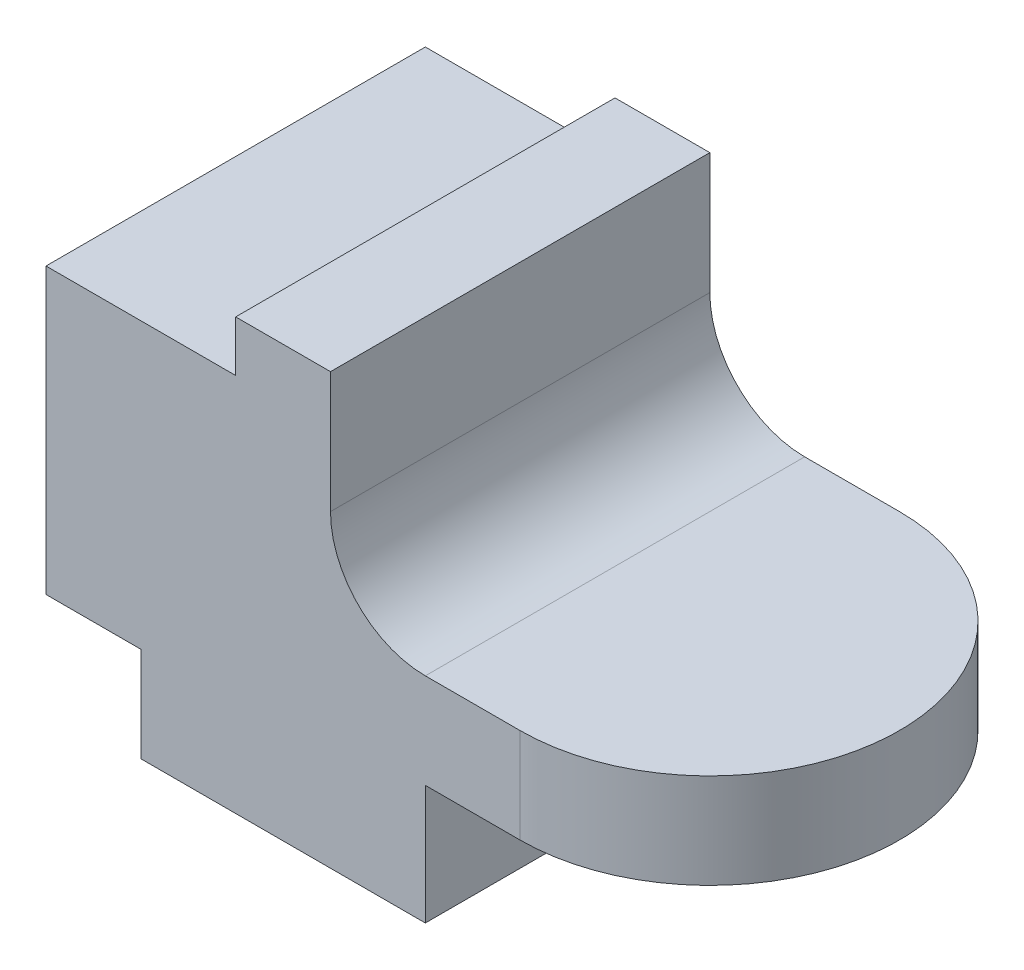
ISO-10303-21;
HEADER;
FILE_DESCRIPTION(('STEP AP214'),'2;1');
FILE_NAME('part.step','',(''),(''),'','','');
FILE_SCHEMA(('AUTOMOTIVE_DESIGN { 1 0 10303 214 1 1 1 1 }'));
ENDSEC;
DATA;
#1=APPLICATION_CONTEXT('core data for automotive mechanical design processes');
#2=APPLICATION_PROTOCOL_DEFINITION('international standard','automotive_design',2000,#1);
#3=PRODUCT_CONTEXT('',#1,'mechanical');
#4=PRODUCT('Part','Part','',(#3));
#5=PRODUCT_RELATED_PRODUCT_CATEGORY('part','',(#4));
#6=PRODUCT_DEFINITION_FORMATION('','',#4);
#7=PRODUCT_DEFINITION_CONTEXT('part definition',#1,'design');
#8=PRODUCT_DEFINITION('design','',#6,#7);
#9=PRODUCT_DEFINITION_SHAPE('','',#8);
#10=(LENGTH_UNIT() NAMED_UNIT(*) SI_UNIT(.MILLI.,.METRE.));
#11=(NAMED_UNIT(*) PLANE_ANGLE_UNIT() SI_UNIT($,.RADIAN.));
#12=(NAMED_UNIT(*) SI_UNIT($,.STERADIAN.) SOLID_ANGLE_UNIT());
#13=UNCERTAINTY_MEASURE_WITH_UNIT(LENGTH_MEASURE(1.E-05),#10,'distance_accuracy_value','');
#14=(GEOMETRIC_REPRESENTATION_CONTEXT(3) GLOBAL_UNCERTAINTY_ASSIGNED_CONTEXT((#13)) GLOBAL_UNIT_ASSIGNED_CONTEXT((#10,
#11,#12)) REPRESENTATION_CONTEXT('',''));
#15=CARTESIAN_POINT('',(0.,0.,0.));
#16=DIRECTION('',(0.,0.,1.));
#17=DIRECTION('',(1.,0.,0.));
#18=AXIS2_PLACEMENT_3D('',#15,#16,#17);
#19=CARTESIAN_POINT('',(34.1908713692946,-8.87966804979253,40.));
#20=DIRECTION('',(0.,1.,0.));
#21=DIRECTION('',(-1.,0.,0.));
#22=AXIS2_PLACEMENT_3D('',#19,#20,#21);
#23=PLANE('',#22);
#24=CARTESIAN_POINT('',(14.1908713692946,-8.87966804979253,20.));
#25=DIRECTION('',(0.,1.,0.));
#26=DIRECTION('',(-1.,0.,0.));
#27=AXIS2_PLACEMENT_3D('',#24,#25,#26);
#28=CIRCLE('',#27,20.);
#29=CARTESIAN_POINT('',(14.1908713692946,-8.87966804979253,40.));
#30=VERTEX_POINT('',#29);
#31=CARTESIAN_POINT('',(14.1908713692946,-8.87966804979253,0.));
#32=VERTEX_POINT('',#31);
#33=EDGE_CURVE('E79',#30,#32,#28,.T.);
#34=ORIENTED_EDGE('',*,*,#33,.F.);
#35=DIRECTION('',(1.,0.,0.));
#36=VECTOR('',#35,1.);
#37=CARTESIAN_POINT('',(34.1908713692946,-8.87966804979253,40.));
#38=LINE('',#37,#36);
#39=CARTESIAN_POINT('',(4.19087136929461,-8.87966804979253,40.));
#40=VERTEX_POINT('',#39);
#41=EDGE_CURVE('E299',#40,#30,#38,.T.);
#42=ORIENTED_EDGE('',*,*,#41,.F.);
#43=DIRECTION('',(0.,0.,-1.));
#44=VECTOR('',#43,1.);
#45=CARTESIAN_POINT('',(4.19087136929461,-8.87966804979253,40.));
#46=LINE('',#45,#44);
#47=CARTESIAN_POINT('',(4.19087136929461,-8.87966804979253,0.));
#48=VERTEX_POINT('',#47);
#49=EDGE_CURVE('E239',#40,#48,#46,.T.);
#50=ORIENTED_EDGE('',*,*,#49,.T.);
#51=DIRECTION('',(1.,0.,0.));
#52=VECTOR('',#51,1.);
#53=CARTESIAN_POINT('',(34.1908713692946,-8.87966804979253,0.));
#54=LINE('',#53,#52);
#55=EDGE_CURVE('E218',#48,#32,#54,.T.);
#56=ORIENTED_EDGE('',*,*,#55,.T.);
#57=EDGE_LOOP('',(#34,#42,#50,#56));
#58=FACE_BOUND('',#57,.T.);
#59=ADVANCED_FACE('F64',(#58),#23,.F.);
#60=CARTESIAN_POINT('',(4.19087136929467,1.12033195020747,40.));
#61=DIRECTION('',(0.,-1.,0.));
#62=DIRECTION('',(0.,0.,-1.));
#63=AXIS2_PLACEMENT_3D('',#60,#61,#62);
#64=PLANE('',#63);
#65=CARTESIAN_POINT('',(14.1908713692946,1.12033195020747,20.));
#66=DIRECTION('',(0.,1.,0.));
#67=DIRECTION('',(0.,0.,1.));
#68=AXIS2_PLACEMENT_3D('',#65,#66,#67);
#69=CIRCLE('',#68,20.);
#70=CARTESIAN_POINT('',(14.1908713692946,1.12033195020747,40.));
#71=VERTEX_POINT('',#70);
#72=CARTESIAN_POINT('',(14.1908713692946,1.12033195020747,0.));
#73=VERTEX_POINT('',#72);
#74=EDGE_CURVE('E313',#71,#73,#69,.T.);
#75=ORIENTED_EDGE('',*,*,#74,.T.);
#76=DIRECTION('',(-1.,0.,0.));
#77=VECTOR('',#76,1.);
#78=CARTESIAN_POINT('',(4.19087136929467,1.12033195020747,0.));
#79=LINE('',#78,#77);
#80=CARTESIAN_POINT('',(4.19087136929468,1.12033195020747,0.));
#81=VERTEX_POINT('',#80);
#82=EDGE_CURVE('E222',#73,#81,#79,.T.);
#83=ORIENTED_EDGE('',*,*,#82,.T.);
#84=DIRECTION('',(0.,0.,-1.));
#85=VECTOR('',#84,1.);
#86=CARTESIAN_POINT('',(4.19087136929468,1.12033195020747,40.));
#87=LINE('',#86,#85);
#88=CARTESIAN_POINT('',(4.19087136929468,1.12033195020747,40.));
#89=VERTEX_POINT('',#88);
#90=EDGE_CURVE('E185',#89,#81,#87,.T.);
#91=ORIENTED_EDGE('',*,*,#90,.F.);
#92=DIRECTION('',(-1.,0.,0.));
#93=VECTOR('',#92,1.);
#94=CARTESIAN_POINT('',(4.19087136929467,1.12033195020747,40.));
#95=LINE('',#94,#93);
#96=EDGE_CURVE('E171',#71,#89,#95,.T.);
#97=ORIENTED_EDGE('',*,*,#96,.F.);
#98=EDGE_LOOP('',(#75,#83,#91,#97));
#99=FACE_BOUND('',#98,.T.);
#100=ADVANCED_FACE('F324',(#99),#64,.F.);
#101=CARTESIAN_POINT('',(-15.8091286307054,18.5477178423236,40.));
#102=DIRECTION('',(1.,0.,0.));
#103=DIRECTION('',(0.,0.,-1.));
#104=AXIS2_PLACEMENT_3D('',#101,#102,#103);
#105=PLANE('',#104);
#106=DIRECTION('',(0.,-1.,0.));
#107=VECTOR('',#106,1.);
#108=CARTESIAN_POINT('',(-15.8091286307054,18.5477178423236,0.));
#109=LINE('',#108,#107);
#110=CARTESIAN_POINT('',(-15.8091286307054,23.9004149377593,0.));
#111=VERTEX_POINT('',#110);
#112=CARTESIAN_POINT('',(-15.8091286307054,18.5477178423236,0.));
#113=VERTEX_POINT('',#112);
#114=EDGE_CURVE('E196',#111,#113,#109,.T.);
#115=ORIENTED_EDGE('',*,*,#114,.T.);
#116=DIRECTION('',(0.,0.,-1.));
#117=VECTOR('',#116,1.);
#118=CARTESIAN_POINT('',(-15.8091286307054,18.5477178423236,40.));
#119=LINE('',#118,#117);
#120=CARTESIAN_POINT('',(-15.8091286307054,18.5477178423236,40.));
#121=VERTEX_POINT('',#120);
#122=EDGE_CURVE('E73',#121,#113,#119,.T.);
#123=ORIENTED_EDGE('',*,*,#122,.F.);
#124=DIRECTION('',(0.,-1.,0.));
#125=VECTOR('',#124,1.);
#126=CARTESIAN_POINT('',(-15.8091286307054,18.5477178423236,40.));
#127=LINE('',#126,#125);
#128=CARTESIAN_POINT('',(-15.8091286307054,23.9004149377593,40.));
#129=VERTEX_POINT('',#128);
#130=EDGE_CURVE('E232',#129,#121,#127,.T.);
#131=ORIENTED_EDGE('',*,*,#130,.F.);
#132=DIRECTION('',(0.,0.,-1.));
#133=VECTOR('',#132,1.);
#134=CARTESIAN_POINT('',(-15.8091286307054,23.9004149377593,40.));
#135=LINE('',#134,#133);
#136=EDGE_CURVE('E192',#129,#111,#135,.T.);
#137=ORIENTED_EDGE('',*,*,#136,.T.);
#138=EDGE_LOOP('',(#115,#123,#131,#137));
#139=FACE_BOUND('',#138,.T.);
#140=ADVANCED_FACE('F66',(#139),#105,.F.);
#141=CARTESIAN_POINT('',(-35.8091286307054,18.5477178423236,40.));
#142=DIRECTION('',(0.,-1.,0.));
#143=DIRECTION('',(1.,0.,0.));
#144=AXIS2_PLACEMENT_3D('',#141,#142,#143);
#145=PLANE('',#144);
#146=DIRECTION('',(-1.,0.,0.));
#147=VECTOR('',#146,1.);
#148=CARTESIAN_POINT('',(-35.8091286307054,18.5477178423236,0.));
#149=LINE('',#148,#147);
#150=CARTESIAN_POINT('',(-35.8091286307054,18.5477178423236,0.));
#151=VERTEX_POINT('',#150);
#152=EDGE_CURVE('E200',#113,#151,#149,.T.);
#153=ORIENTED_EDGE('',*,*,#152,.T.);
#154=DIRECTION('',(0.,0.,-1.));
#155=VECTOR('',#154,1.);
#156=CARTESIAN_POINT('',(-35.8091286307054,18.5477178423236,40.));
#157=LINE('',#156,#155);
#158=CARTESIAN_POINT('',(-35.8091286307054,18.5477178423236,40.));
#159=VERTEX_POINT('',#158);
#160=EDGE_CURVE('E259',#159,#151,#157,.T.);
#161=ORIENTED_EDGE('',*,*,#160,.F.);
#162=DIRECTION('',(-1.,0.,0.));
#163=VECTOR('',#162,1.);
#164=CARTESIAN_POINT('',(-35.8091286307054,18.5477178423236,40.));
#165=LINE('',#164,#163);
#166=EDGE_CURVE('E139',#121,#159,#165,.T.);
#167=ORIENTED_EDGE('',*,*,#166,.F.);
#168=ORIENTED_EDGE('',*,*,#122,.T.);
#169=EDGE_LOOP('',(#153,#161,#167,#168));
#170=FACE_BOUND('',#169,.T.);
#171=ADVANCED_FACE('F264',(#170),#145,.F.);
#172=CARTESIAN_POINT('',(-35.8091286307054,-11.4522821576764,40.));
#173=DIRECTION('',(1.,0.,0.));
#174=DIRECTION('',(0.,0.,-1.));
#175=AXIS2_PLACEMENT_3D('',#172,#173,#174);
#176=PLANE('',#175);
#177=DIRECTION('',(0.,-1.,0.));
#178=VECTOR('',#177,1.);
#179=CARTESIAN_POINT('',(-35.8091286307054,-11.4522821576764,0.));
#180=LINE('',#179,#178);
#181=CARTESIAN_POINT('',(-35.8091286307054,-11.4522821576764,0.));
#182=VERTEX_POINT('',#181);
#183=EDGE_CURVE('E203',#151,#182,#180,.T.);
#184=ORIENTED_EDGE('',*,*,#183,.T.);
#185=DIRECTION('',(0.,0.,-1.));
#186=VECTOR('',#185,1.);
#187=CARTESIAN_POINT('',(-35.8091286307054,-11.4522821576764,40.));
#188=LINE('',#187,#186);
#189=CARTESIAN_POINT('',(-35.8091286307054,-11.4522821576764,40.));
#190=VERTEX_POINT('',#189);
#191=EDGE_CURVE('E255',#190,#182,#188,.T.);
#192=ORIENTED_EDGE('',*,*,#191,.F.);
#193=DIRECTION('',(0.,-1.,0.));
#194=VECTOR('',#193,1.);
#195=CARTESIAN_POINT('',(-35.8091286307054,-11.4522821576764,40.));
#196=LINE('',#195,#194);
#197=EDGE_CURVE('E285',#159,#190,#196,.T.);
#198=ORIENTED_EDGE('',*,*,#197,.F.);
#199=ORIENTED_EDGE('',*,*,#160,.T.);
#200=EDGE_LOOP('',(#184,#192,#198,#199));
#201=FACE_BOUND('',#200,.T.);
#202=ADVANCED_FACE('F275',(#201),#176,.F.);
#203=CARTESIAN_POINT('',(-25.8091286307054,-11.4522821576764,40.));
#204=DIRECTION('',(0.,1.,0.));
#205=DIRECTION('',(0.,0.,1.));
#206=AXIS2_PLACEMENT_3D('',#203,#204,#205);
#207=PLANE('',#206);
#208=DIRECTION('',(1.,0.,0.));
#209=VECTOR('',#208,1.);
#210=CARTESIAN_POINT('',(-25.8091286307054,-11.4522821576764,0.));
#211=LINE('',#210,#209);
#212=CARTESIAN_POINT('',(-25.8091286307054,-11.4522821576764,0.));
#213=VERTEX_POINT('',#212);
#214=EDGE_CURVE('E206',#182,#213,#211,.T.);
#215=ORIENTED_EDGE('',*,*,#214,.T.);
#216=DIRECTION('',(0.,0.,-1.));
#217=VECTOR('',#216,1.);
#218=CARTESIAN_POINT('',(-25.8091286307054,-11.4522821576764,40.));
#219=LINE('',#218,#217);
#220=CARTESIAN_POINT('',(-25.8091286307054,-11.4522821576764,40.));
#221=VERTEX_POINT('',#220);
#222=EDGE_CURVE('E251',#221,#213,#219,.T.);
#223=ORIENTED_EDGE('',*,*,#222,.F.);
#224=DIRECTION('',(1.,0.,0.));
#225=VECTOR('',#224,1.);
#226=CARTESIAN_POINT('',(-25.8091286307054,-11.4522821576764,40.));
#227=LINE('',#226,#225);
#228=EDGE_CURVE('E281',#190,#221,#227,.T.);
#229=ORIENTED_EDGE('',*,*,#228,.F.);
#230=ORIENTED_EDGE('',*,*,#191,.T.);
#231=EDGE_LOOP('',(#215,#223,#229,#230));
#232=FACE_BOUND('',#231,.T.);
#233=ADVANCED_FACE('F279',(#232),#207,.F.);
#234=CARTESIAN_POINT('',(-25.8091286307054,-21.4522821576764,40.));
#235=DIRECTION('',(1.,0.,0.));
#236=DIRECTION('',(0.,1.,0.));
#237=AXIS2_PLACEMENT_3D('',#234,#235,#236);
#238=PLANE('',#237);
#239=DIRECTION('',(0.,-1.,0.));
#240=VECTOR('',#239,1.);
#241=CARTESIAN_POINT('',(-25.8091286307054,-21.4522821576764,0.));
#242=LINE('',#241,#240);
#243=CARTESIAN_POINT('',(-25.8091286307054,-21.4522821576764,0.));
#244=VERTEX_POINT('',#243);
#245=EDGE_CURVE('E209',#213,#244,#242,.T.);
#246=ORIENTED_EDGE('',*,*,#245,.T.);
#247=DIRECTION('',(0.,0.,-1.));
#248=VECTOR('',#247,1.);
#249=CARTESIAN_POINT('',(-25.8091286307054,-21.4522821576764,40.));
#250=LINE('',#249,#248);
#251=CARTESIAN_POINT('',(-25.8091286307054,-21.4522821576764,40.));
#252=VERTEX_POINT('',#251);
#253=EDGE_CURVE('E247',#252,#244,#250,.T.);
#254=ORIENTED_EDGE('',*,*,#253,.F.);
#255=DIRECTION('',(0.,-1.,0.));
#256=VECTOR('',#255,1.);
#257=CARTESIAN_POINT('',(-25.8091286307054,-21.4522821576764,40.));
#258=LINE('',#257,#256);
#259=EDGE_CURVE('E284',#221,#252,#258,.T.);
#260=ORIENTED_EDGE('',*,*,#259,.F.);
#261=ORIENTED_EDGE('',*,*,#222,.T.);
#262=EDGE_LOOP('',(#246,#254,#260,#261));
#263=FACE_BOUND('',#262,.T.);
#264=ADVANCED_FACE('F353',(#263),#238,.F.);
#265=CARTESIAN_POINT('',(4.19087136929461,-21.4522821576764,40.));
#266=DIRECTION('',(0.,1.,0.));
#267=DIRECTION('',(0.,0.,1.));
#268=AXIS2_PLACEMENT_3D('',#265,#266,#267);
#269=PLANE('',#268);
#270=DIRECTION('',(1.,0.,0.));
#271=VECTOR('',#270,1.);
#272=CARTESIAN_POINT('',(4.19087136929461,-21.4522821576764,0.));
#273=LINE('',#272,#271);
#274=CARTESIAN_POINT('',(4.19087136929461,-21.4522821576764,0.));
#275=VERTEX_POINT('',#274);
#276=EDGE_CURVE('E212',#244,#275,#273,.T.);
#277=ORIENTED_EDGE('',*,*,#276,.T.);
#278=DIRECTION('',(0.,0.,-1.));
#279=VECTOR('',#278,1.);
#280=CARTESIAN_POINT('',(4.19087136929461,-21.4522821576764,40.));
#281=LINE('',#280,#279);
#282=CARTESIAN_POINT('',(4.19087136929461,-21.4522821576764,40.));
#283=VERTEX_POINT('',#282);
#284=EDGE_CURVE('E243',#283,#275,#281,.T.);
#285=ORIENTED_EDGE('',*,*,#284,.F.);
#286=DIRECTION('',(1.,0.,0.));
#287=VECTOR('',#286,1.);
#288=CARTESIAN_POINT('',(4.19087136929461,-21.4522821576764,40.));
#289=LINE('',#288,#287);
#290=EDGE_CURVE('E289',#252,#283,#289,.T.);
#291=ORIENTED_EDGE('',*,*,#290,.F.);
#292=ORIENTED_EDGE('',*,*,#253,.T.);
#293=EDGE_LOOP('',(#277,#285,#291,#292));
#294=FACE_BOUND('',#293,.T.);
#295=ADVANCED_FACE('F349',(#294),#269,.F.);
#296=CARTESIAN_POINT('',(4.19087136929461,-8.87966804979253,40.));
#297=DIRECTION('',(-1.,0.,0.));
#298=DIRECTION('',(0.,-1.,0.));
#299=AXIS2_PLACEMENT_3D('',#296,#297,#298);
#300=PLANE('',#299);
#301=DIRECTION('',(0.,1.,0.));
#302=VECTOR('',#301,1.);
#303=CARTESIAN_POINT('',(4.19087136929461,-8.87966804979253,0.));
#304=LINE('',#303,#302);
#305=EDGE_CURVE('E215',#275,#48,#304,.T.);
#306=ORIENTED_EDGE('',*,*,#305,.T.);
#307=ORIENTED_EDGE('',*,*,#49,.F.);
#308=DIRECTION('',(0.,1.,0.));
#309=VECTOR('',#308,1.);
#310=CARTESIAN_POINT('',(4.19087136929461,-8.87966804979253,40.));
#311=LINE('',#310,#309);
#312=EDGE_CURVE('E296',#283,#40,#311,.T.);
#313=ORIENTED_EDGE('',*,*,#312,.F.);
#314=ORIENTED_EDGE('',*,*,#284,.T.);
#315=EDGE_LOOP('',(#306,#307,#313,#314));
#316=FACE_BOUND('',#315,.T.);
#317=ADVANCED_FACE('F346',(#316),#300,.F.);
#318=CARTESIAN_POINT('',(4.1908713692946,11.1203319502075,40.));
#319=DIRECTION('',(0.,0.,-1.));
#320=DIRECTION('',(-1.,0.,0.));
#321=AXIS2_PLACEMENT_3D('',#318,#319,#320);
#322=CYLINDRICAL_SURFACE('',#321,10.);
#323=CARTESIAN_POINT('',(4.1908713692946,11.1203319502075,0.));
#324=DIRECTION('',(0.,0.,-1.));
#325=DIRECTION('',(-1.,0.,0.));
#326=AXIS2_PLACEMENT_3D('',#323,#324,#325);
#327=CIRCLE('',#326,10.);
#328=CARTESIAN_POINT('',(-5.8091286307054,11.1203319502075,0.));
#329=VERTEX_POINT('',#328);
#330=EDGE_CURVE('E181',#81,#329,#327,.T.);
#331=ORIENTED_EDGE('',*,*,#330,.T.);
#332=DIRECTION('',(0.,0.,-1.));
#333=VECTOR('',#332,1.);
#334=CARTESIAN_POINT('',(-5.8091286307054,11.1203319502075,40.));
#335=LINE('',#334,#333);
#336=CARTESIAN_POINT('',(-5.8091286307054,11.1203319502075,40.));
#337=VERTEX_POINT('',#336);
#338=EDGE_CURVE('E178',#337,#329,#335,.T.);
#339=ORIENTED_EDGE('',*,*,#338,.F.);
#340=CARTESIAN_POINT('',(4.1908713692946,11.1203319502075,40.));
#341=DIRECTION('',(0.,0.,-1.));
#342=DIRECTION('',(-1.,0.,0.));
#343=AXIS2_PLACEMENT_3D('',#340,#341,#342);
#344=CIRCLE('',#343,10.);
#345=EDGE_CURVE('E163',#89,#337,#344,.T.);
#346=ORIENTED_EDGE('',*,*,#345,.F.);
#347=ORIENTED_EDGE('',*,*,#90,.T.);
#348=EDGE_LOOP('',(#331,#339,#346,#347));
#349=FACE_BOUND('',#348,.T.);
#350=ADVANCED_FACE('F179',(#349),#322,.F.);
#351=CARTESIAN_POINT('',(-5.8091286307054,23.9004149377593,40.));
#352=DIRECTION('',(-1.,0.,0.));
#353=DIRECTION('',(0.,-1.,0.));
#354=AXIS2_PLACEMENT_3D('',#351,#352,#353);
#355=PLANE('',#354);
#356=DIRECTION('',(0.,1.,0.));
#357=VECTOR('',#356,1.);
#358=CARTESIAN_POINT('',(-5.8091286307054,23.9004149377593,0.));
#359=LINE('',#358,#357);
#360=CARTESIAN_POINT('',(-5.8091286307054,23.9004149377593,0.));
#361=VERTEX_POINT('',#360);
#362=EDGE_CURVE('E227',#329,#361,#359,.T.);
#363=ORIENTED_EDGE('',*,*,#362,.T.);
#364=DIRECTION('',(0.,0.,-1.));
#365=VECTOR('',#364,1.);
#366=CARTESIAN_POINT('',(-5.8091286307054,23.9004149377593,40.));
#367=LINE('',#366,#365);
#368=CARTESIAN_POINT('',(-5.8091286307054,23.9004149377593,40.));
#369=VERTEX_POINT('',#368);
#370=EDGE_CURVE('E186',#369,#361,#367,.T.);
#371=ORIENTED_EDGE('',*,*,#370,.F.);
#372=DIRECTION('',(0.,1.,0.));
#373=VECTOR('',#372,1.);
#374=CARTESIAN_POINT('',(-5.8091286307054,23.9004149377593,40.));
#375=LINE('',#374,#373);
#376=EDGE_CURVE('E167',#337,#369,#375,.T.);
#377=ORIENTED_EDGE('',*,*,#376,.F.);
#378=ORIENTED_EDGE('',*,*,#338,.T.);
#379=EDGE_LOOP('',(#363,#371,#377,#378));
#380=FACE_BOUND('',#379,.T.);
#381=ADVANCED_FACE('F188',(#380),#355,.F.);
#382=CARTESIAN_POINT('',(-15.8091286307054,23.9004149377593,40.));
#383=DIRECTION('',(0.,-1.,0.));
#384=DIRECTION('',(1.,0.,0.));
#385=AXIS2_PLACEMENT_3D('',#382,#383,#384);
#386=PLANE('',#385);
#387=DIRECTION('',(-1.,0.,0.));
#388=VECTOR('',#387,1.);
#389=CARTESIAN_POINT('',(-15.8091286307054,23.9004149377593,0.));
#390=LINE('',#389,#388);
#391=EDGE_CURVE('E130',#361,#111,#390,.T.);
#392=ORIENTED_EDGE('',*,*,#391,.T.);
#393=ORIENTED_EDGE('',*,*,#136,.F.);
#394=DIRECTION('',(-1.,0.,0.));
#395=VECTOR('',#394,1.);
#396=CARTESIAN_POINT('',(-15.8091286307054,23.9004149377593,40.));
#397=LINE('',#396,#395);
#398=EDGE_CURVE('E88',#369,#129,#397,.T.);
#399=ORIENTED_EDGE('',*,*,#398,.F.);
#400=ORIENTED_EDGE('',*,*,#370,.T.);
#401=EDGE_LOOP('',(#392,#393,#399,#400));
#402=FACE_BOUND('',#401,.T.);
#403=ADVANCED_FACE('F328',(#402),#386,.F.);
#404=CARTESIAN_POINT('',(4.1908713692946,11.1203319502075,40.));
#405=DIRECTION('',(0.,0.,-1.));
#406=DIRECTION('',(-1.,0.,0.));
#407=AXIS2_PLACEMENT_3D('',#404,#405,#406);
#408=PLANE('',#407);
#409=ORIENTED_EDGE('',*,*,#197,.T.);
#410=ORIENTED_EDGE('',*,*,#228,.T.);
#411=ORIENTED_EDGE('',*,*,#259,.T.);
#412=ORIENTED_EDGE('',*,*,#290,.T.);
#413=ORIENTED_EDGE('',*,*,#312,.T.);
#414=ORIENTED_EDGE('',*,*,#41,.T.);
#415=DIRECTION('',(0.,1.,0.));
#416=VECTOR('',#415,1.);
#417=CARTESIAN_POINT('',(14.1908713692946,-38.8796680497925,40.));
#418=LINE('',#417,#416);
#419=EDGE_CURVE('E305',#30,#71,#418,.T.);
#420=ORIENTED_EDGE('',*,*,#419,.T.);
#421=ORIENTED_EDGE('',*,*,#96,.T.);
#422=ORIENTED_EDGE('',*,*,#345,.T.);
#423=ORIENTED_EDGE('',*,*,#376,.T.);
#424=ORIENTED_EDGE('',*,*,#398,.T.);
#425=ORIENTED_EDGE('',*,*,#130,.T.);
#426=ORIENTED_EDGE('',*,*,#166,.T.);
#427=EDGE_LOOP('',(#409,#410,#411,#412,#413,#414,#420,#421,#422,#423,#424,#425,#426));
#428=FACE_BOUND('',#427,.T.);
#429=ADVANCED_FACE('F165',(#428),#408,.F.);
#430=CARTESIAN_POINT('',(4.1908713692946,11.1203319502075,0.));
#431=DIRECTION('',(0.,0.,-1.));
#432=DIRECTION('',(-1.,0.,0.));
#433=AXIS2_PLACEMENT_3D('',#430,#431,#432);
#434=PLANE('',#433);
#435=ORIENTED_EDGE('',*,*,#330,.F.);
#436=ORIENTED_EDGE('',*,*,#82,.F.);
#437=DIRECTION('',(0.,1.,0.));
#438=VECTOR('',#437,1.);
#439=CARTESIAN_POINT('',(14.1908713692946,-38.8796680497925,0.));
#440=LINE('',#439,#438);
#441=EDGE_CURVE('E13',#32,#73,#440,.T.);
#442=ORIENTED_EDGE('',*,*,#441,.F.);
#443=ORIENTED_EDGE('',*,*,#55,.F.);
#444=ORIENTED_EDGE('',*,*,#305,.F.);
#445=ORIENTED_EDGE('',*,*,#276,.F.);
#446=ORIENTED_EDGE('',*,*,#245,.F.);
#447=ORIENTED_EDGE('',*,*,#214,.F.);
#448=ORIENTED_EDGE('',*,*,#183,.F.);
#449=ORIENTED_EDGE('',*,*,#152,.F.);
#450=ORIENTED_EDGE('',*,*,#114,.F.);
#451=ORIENTED_EDGE('',*,*,#391,.F.);
#452=ORIENTED_EDGE('',*,*,#362,.F.);
#453=EDGE_LOOP('',(#435,#436,#442,#443,#444,#445,#446,#447,#448,#449,#450,#451,#452));
#454=FACE_BOUND('',#453,.T.);
#455=ADVANCED_FACE('F269',(#454),#434,.T.);
#456=CARTESIAN_POINT('',(14.1908713692946,-38.8796680497925,20.));
#457=DIRECTION('',(0.,1.,0.));
#458=DIRECTION('',(0.,0.,1.));
#459=AXIS2_PLACEMENT_3D('',#456,#457,#458);
#460=CYLINDRICAL_SURFACE('',#459,20.);
#461=ORIENTED_EDGE('',*,*,#33,.T.);
#462=ORIENTED_EDGE('',*,*,#441,.T.);
#463=ORIENTED_EDGE('',*,*,#74,.F.);
#464=ORIENTED_EDGE('',*,*,#419,.F.);
#465=EDGE_LOOP('',(#461,#462,#463,#464));
#466=FACE_BOUND('',#465,.T.);
#467=ADVANCED_FACE('F327',(#466),#460,.T.);
#468=CLOSED_SHELL('',(#59,#100,#140,#171,#202,#233,#264,#295,#317,#350,#381,#403,#429,#455,#467));
#469=MANIFOLD_SOLID_BREP('B2',#468);
#470=ADVANCED_BREP_SHAPE_REPRESENTATION('',(#18,#469),#14);
#471=SHAPE_DEFINITION_REPRESENTATION(#9,#470);
ENDSEC;
END-ISO-10303-21;
